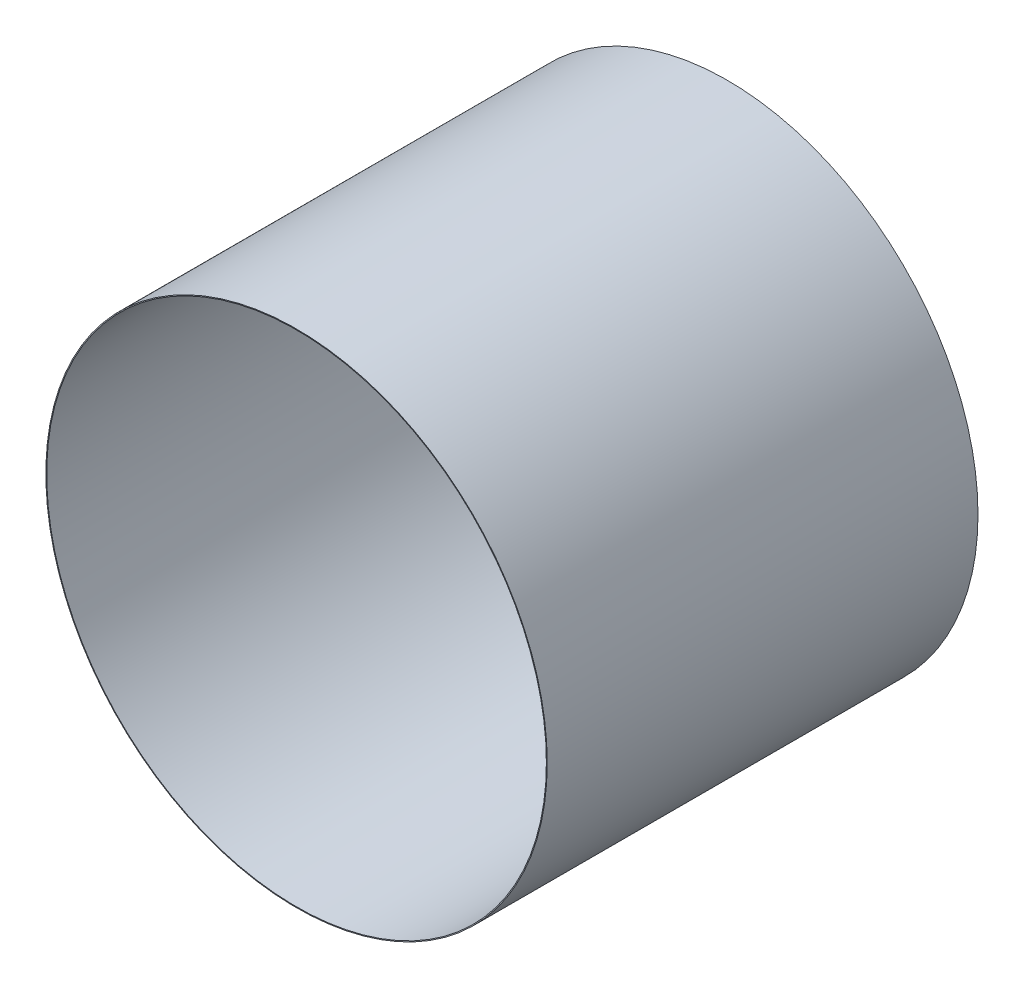
ISO-10303-21;
HEADER;
FILE_DESCRIPTION(('STEP AP214'),'2;1');
FILE_NAME('part.step','',(''),(''),'','','');
FILE_SCHEMA(('AUTOMOTIVE_DESIGN { 1 0 10303 214 1 1 1 1 }'));
ENDSEC;
DATA;
#1=APPLICATION_CONTEXT('core data for automotive mechanical design processes');
#2=APPLICATION_PROTOCOL_DEFINITION('international standard','automotive_design',2000,#1);
#3=PRODUCT_CONTEXT('',#1,'mechanical');
#4=PRODUCT('Part','Part','',(#3));
#5=PRODUCT_RELATED_PRODUCT_CATEGORY('part','',(#4));
#6=PRODUCT_DEFINITION_FORMATION('','',#4);
#7=PRODUCT_DEFINITION_CONTEXT('part definition',#1,'design');
#8=PRODUCT_DEFINITION('design','',#6,#7);
#9=PRODUCT_DEFINITION_SHAPE('','',#8);
#10=(LENGTH_UNIT() NAMED_UNIT(*) SI_UNIT(.MILLI.,.METRE.));
#11=(NAMED_UNIT(*) PLANE_ANGLE_UNIT() SI_UNIT($,.RADIAN.));
#12=(NAMED_UNIT(*) SI_UNIT($,.STERADIAN.) SOLID_ANGLE_UNIT());
#13=UNCERTAINTY_MEASURE_WITH_UNIT(LENGTH_MEASURE(1.E-05),#10,'distance_accuracy_value','');
#14=(GEOMETRIC_REPRESENTATION_CONTEXT(3) GLOBAL_UNCERTAINTY_ASSIGNED_CONTEXT((#13)) GLOBAL_UNIT_ASSIGNED_CONTEXT((#10,
#11,#12)) REPRESENTATION_CONTEXT('',''));
#15=CARTESIAN_POINT('',(0.,0.,0.));
#16=DIRECTION('',(0.,0.,1.));
#17=DIRECTION('',(1.,0.,0.));
#18=AXIS2_PLACEMENT_3D('',#15,#16,#17);
#19=CARTESIAN_POINT('',(0.,0.,25.));
#20=DIRECTION('',(0.,0.,1.));
#21=DIRECTION('',(1.,0.,0.));
#22=AXIS2_PLACEMENT_3D('',#19,#20,#21);
#23=PLANE('',#22);
#24=CARTESIAN_POINT('',(0.,0.,25.));
#25=DIRECTION('',(0.,0.,1.));
#26=DIRECTION('',(1.,0.,0.));
#27=AXIS2_PLACEMENT_3D('',#24,#25,#26);
#28=CIRCLE('',#27,14.55);
#29=CARTESIAN_POINT('',(14.55,0.,25.));
#30=VERTEX_POINT('',#29);
#31=EDGE_CURVE('E10',#30,#30,#28,.T.);
#32=ORIENTED_EDGE('',*,*,#31,.T.);
#33=EDGE_LOOP('',(#32));
#34=FACE_BOUND('',#33,.T.);
#35=CARTESIAN_POINT('',(0.,0.,25.));
#36=DIRECTION('',(0.,0.,1.));
#37=DIRECTION('',(1.,0.,0.));
#38=AXIS2_PLACEMENT_3D('',#35,#36,#37);
#39=CIRCLE('',#38,14.5);
#40=CARTESIAN_POINT('',(14.5,0.,25.));
#41=VERTEX_POINT('',#40);
#42=EDGE_CURVE('E42',#41,#41,#39,.T.);
#43=ORIENTED_EDGE('',*,*,#42,.F.);
#44=EDGE_LOOP('',(#43));
#45=FACE_BOUND('',#44,.T.);
#46=ADVANCED_FACE('F31',(#34,#45),#23,.T.);
#47=CARTESIAN_POINT('',(0.,0.,0.));
#48=DIRECTION('',(0.,0.,1.));
#49=DIRECTION('',(1.,0.,0.));
#50=AXIS2_PLACEMENT_3D('',#47,#48,#49);
#51=PLANE('',#50);
#52=CARTESIAN_POINT('',(0.,0.,0.));
#53=DIRECTION('',(0.,0.,1.));
#54=DIRECTION('',(1.,0.,0.));
#55=AXIS2_PLACEMENT_3D('',#52,#53,#54);
#56=CIRCLE('',#55,14.55);
#57=CARTESIAN_POINT('',(14.55,0.,0.));
#58=VERTEX_POINT('',#57);
#59=EDGE_CURVE('E35',#58,#58,#56,.T.);
#60=ORIENTED_EDGE('',*,*,#59,.F.);
#61=EDGE_LOOP('',(#60));
#62=FACE_BOUND('',#61,.T.);
#63=CARTESIAN_POINT('',(0.,0.,0.));
#64=DIRECTION('',(0.,0.,1.));
#65=DIRECTION('',(1.,0.,0.));
#66=AXIS2_PLACEMENT_3D('',#63,#64,#65);
#67=CIRCLE('',#66,14.5);
#68=CARTESIAN_POINT('',(14.5,0.,0.));
#69=VERTEX_POINT('',#68);
#70=EDGE_CURVE('E44',#69,#69,#67,.T.);
#71=ORIENTED_EDGE('',*,*,#70,.T.);
#72=EDGE_LOOP('',(#71));
#73=FACE_BOUND('',#72,.T.);
#74=ADVANCED_FACE('F54',(#62,#73),#51,.F.);
#75=CARTESIAN_POINT('',(0.,0.,25.));
#76=DIRECTION('',(0.,0.,-1.));
#77=DIRECTION('',(-1.,0.,0.));
#78=AXIS2_PLACEMENT_3D('',#75,#76,#77);
#79=CYLINDRICAL_SURFACE('',#78,14.55);
#80=ORIENTED_EDGE('',*,*,#31,.F.);
#81=EDGE_LOOP('',(#80));
#82=FACE_BOUND('',#81,.T.);
#83=ORIENTED_EDGE('',*,*,#59,.T.);
#84=EDGE_LOOP('',(#83));
#85=FACE_BOUND('',#84,.T.);
#86=ADVANCED_FACE('F33',(#82,#85),#79,.T.);
#87=CARTESIAN_POINT('',(0.,0.,25.));
#88=DIRECTION('',(0.,0.,-1.));
#89=DIRECTION('',(-1.,0.,0.));
#90=AXIS2_PLACEMENT_3D('',#87,#88,#89);
#91=CYLINDRICAL_SURFACE('',#90,14.5);
#92=ORIENTED_EDGE('',*,*,#42,.T.);
#93=EDGE_LOOP('',(#92));
#94=FACE_BOUND('',#93,.T.);
#95=ORIENTED_EDGE('',*,*,#70,.F.);
#96=EDGE_LOOP('',(#95));
#97=FACE_BOUND('',#96,.T.);
#98=ADVANCED_FACE('F50',(#94,#97),#91,.F.);
#99=CLOSED_SHELL('',(#46,#74,#86,#98));
#100=MANIFOLD_SOLID_BREP('B2',#99);
#101=ADVANCED_BREP_SHAPE_REPRESENTATION('',(#18,#100),#14);
#102=SHAPE_DEFINITION_REPRESENTATION(#9,#101);
ENDSEC;
END-ISO-10303-21;
